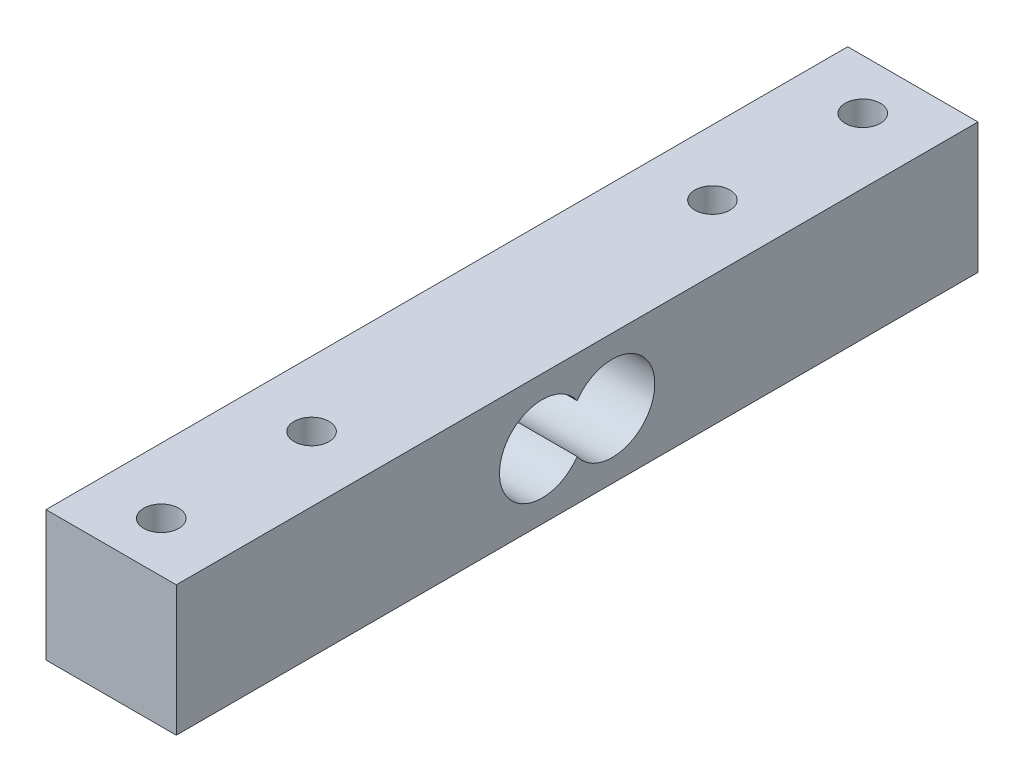
ISO-10303-21;
HEADER;
FILE_DESCRIPTION(('STEP AP214'),'2;1');
FILE_NAME('part.step','',(''),(''),'','','');
FILE_SCHEMA(('AUTOMOTIVE_DESIGN { 1 0 10303 214 1 1 1 1 }'));
ENDSEC;
DATA;
#1=APPLICATION_CONTEXT('core data for automotive mechanical design processes');
#2=APPLICATION_PROTOCOL_DEFINITION('international standard','automotive_design',2000,#1);
#3=PRODUCT_CONTEXT('',#1,'mechanical');
#4=PRODUCT('Part','Part','',(#3));
#5=PRODUCT_RELATED_PRODUCT_CATEGORY('part','',(#4));
#6=PRODUCT_DEFINITION_FORMATION('','',#4);
#7=PRODUCT_DEFINITION_CONTEXT('part definition',#1,'design');
#8=PRODUCT_DEFINITION('design','',#6,#7);
#9=PRODUCT_DEFINITION_SHAPE('','',#8);
#10=(LENGTH_UNIT() NAMED_UNIT(*) SI_UNIT(.MILLI.,.METRE.));
#11=(NAMED_UNIT(*) PLANE_ANGLE_UNIT() SI_UNIT($,.RADIAN.));
#12=(NAMED_UNIT(*) SI_UNIT($,.STERADIAN.) SOLID_ANGLE_UNIT());
#13=UNCERTAINTY_MEASURE_WITH_UNIT(LENGTH_MEASURE(1.E-05),#10,'distance_accuracy_value','');
#14=(GEOMETRIC_REPRESENTATION_CONTEXT(3) GLOBAL_UNCERTAINTY_ASSIGNED_CONTEXT((#13)) GLOBAL_UNIT_ASSIGNED_CONTEXT((#10,
#11,#12)) REPRESENTATION_CONTEXT('',''));
#15=CARTESIAN_POINT('',(0.,0.,0.));
#16=DIRECTION('',(0.,0.,1.));
#17=DIRECTION('',(1.,0.,0.));
#18=AXIS2_PLACEMENT_3D('',#15,#16,#17);
#19=CARTESIAN_POINT('',(6.5,6.5,40.));
#20=DIRECTION('',(-1.,0.,0.));
#21=DIRECTION('',(0.,0.,1.));
#22=AXIS2_PLACEMENT_3D('',#19,#20,#21);
#23=PLANE('',#22);
#24=CARTESIAN_POINT('',(6.5,0.,3.5));
#25=DIRECTION('',(1.,0.,0.));
#26=DIRECTION('',(0.,0.,-1.));
#27=AXIS2_PLACEMENT_3D('',#24,#25,#26);
#28=CIRCLE('',#27,4.25);
#29=CARTESIAN_POINT('',(6.5,2.41091269024824,0.));
#30=VERTEX_POINT('',#29);
#31=CARTESIAN_POINT('',(6.5,-2.41091269024824,0.));
#32=VERTEX_POINT('',#31);
#33=EDGE_CURVE('E99',#30,#32,#28,.T.);
#34=ORIENTED_EDGE('',*,*,#33,.F.);
#35=CARTESIAN_POINT('',(6.5,0.,-3.5));
#36=DIRECTION('',(1.,0.,0.));
#37=DIRECTION('',(0.,0.,-1.));
#38=AXIS2_PLACEMENT_3D('',#35,#36,#37);
#39=CIRCLE('',#38,4.25);
#40=EDGE_CURVE('E54',#32,#30,#39,.T.);
#41=ORIENTED_EDGE('',*,*,#40,.F.);
#42=EDGE_LOOP('',(#34,#41));
#43=FACE_BOUND('',#42,.T.);
#44=DIRECTION('',(0.,0.,-1.));
#45=VECTOR('',#44,1.);
#46=CARTESIAN_POINT('',(6.5,-6.5,40.));
#47=LINE('',#46,#45);
#48=CARTESIAN_POINT('',(6.5,-6.5,40.));
#49=VERTEX_POINT('',#48);
#50=CARTESIAN_POINT('',(6.5,-6.5,-40.));
#51=VERTEX_POINT('',#50);
#52=EDGE_CURVE('E95',#49,#51,#47,.T.);
#53=ORIENTED_EDGE('',*,*,#52,.T.);
#54=DIRECTION('',(0.,-1.,0.));
#55=VECTOR('',#54,1.);
#56=CARTESIAN_POINT('',(6.5,6.5,-40.));
#57=LINE('',#56,#55);
#58=CARTESIAN_POINT('',(6.5,6.5,-40.));
#59=VERTEX_POINT('',#58);
#60=EDGE_CURVE('E11',#59,#51,#57,.T.);
#61=ORIENTED_EDGE('',*,*,#60,.F.);
#62=DIRECTION('',(0.,0.,-1.));
#63=VECTOR('',#62,1.);
#64=CARTESIAN_POINT('',(6.5,6.5,40.));
#65=LINE('',#64,#63);
#66=CARTESIAN_POINT('',(6.5,6.5,40.));
#67=VERTEX_POINT('',#66);
#68=EDGE_CURVE('E123',#67,#59,#65,.T.);
#69=ORIENTED_EDGE('',*,*,#68,.F.);
#70=DIRECTION('',(0.,-1.,0.));
#71=VECTOR('',#70,1.);
#72=CARTESIAN_POINT('',(6.5,6.5,40.));
#73=LINE('',#72,#71);
#74=EDGE_CURVE('E137',#67,#49,#73,.T.);
#75=ORIENTED_EDGE('',*,*,#74,.T.);
#76=EDGE_LOOP('',(#53,#61,#69,#75));
#77=FACE_BOUND('',#76,.T.);
#78=ADVANCED_FACE('F39',(#43,#77),#23,.F.);
#79=CARTESIAN_POINT('',(-6.5,6.5,-40.));
#80=DIRECTION('',(0.,0.,1.));
#81=DIRECTION('',(1.,0.,0.));
#82=AXIS2_PLACEMENT_3D('',#79,#80,#81);
#83=PLANE('',#82);
#84=DIRECTION('',(-1.,0.,0.));
#85=VECTOR('',#84,1.);
#86=CARTESIAN_POINT('',(-6.5,-6.5,-40.));
#87=LINE('',#86,#85);
#88=CARTESIAN_POINT('',(-6.5,-6.5,-40.));
#89=VERTEX_POINT('',#88);
#90=EDGE_CURVE('E141',#51,#89,#87,.T.);
#91=ORIENTED_EDGE('',*,*,#90,.T.);
#92=DIRECTION('',(0.,-1.,0.));
#93=VECTOR('',#92,1.);
#94=CARTESIAN_POINT('',(-6.5,6.5,-40.));
#95=LINE('',#94,#93);
#96=CARTESIAN_POINT('',(-6.5,6.5,-40.));
#97=VERTEX_POINT('',#96);
#98=EDGE_CURVE('E47',#97,#89,#95,.T.);
#99=ORIENTED_EDGE('',*,*,#98,.F.);
#100=DIRECTION('',(-1.,0.,0.));
#101=VECTOR('',#100,1.);
#102=CARTESIAN_POINT('',(-6.5,6.5,-40.));
#103=LINE('',#102,#101);
#104=EDGE_CURVE('E127',#59,#97,#103,.T.);
#105=ORIENTED_EDGE('',*,*,#104,.F.);
#106=ORIENTED_EDGE('',*,*,#60,.T.);
#107=EDGE_LOOP('',(#91,#99,#105,#106));
#108=FACE_BOUND('',#107,.T.);
#109=ADVANCED_FACE('F176',(#108),#83,.F.);
#110=CARTESIAN_POINT('',(-6.5,6.5,40.));
#111=DIRECTION('',(1.,0.,0.));
#112=DIRECTION('',(0.,0.,-1.));
#113=AXIS2_PLACEMENT_3D('',#110,#111,#112);
#114=PLANE('',#113);
#115=CARTESIAN_POINT('',(-6.5,0.,3.5));
#116=DIRECTION('',(1.,0.,0.));
#117=DIRECTION('',(0.,0.,-1.));
#118=AXIS2_PLACEMENT_3D('',#115,#116,#117);
#119=CIRCLE('',#118,4.25);
#120=CARTESIAN_POINT('',(-6.5,2.41091269024824,0.));
#121=VERTEX_POINT('',#120);
#122=CARTESIAN_POINT('',(-6.5,-2.41091269024824,0.));
#123=VERTEX_POINT('',#122);
#124=EDGE_CURVE('E118',#121,#123,#119,.T.);
#125=ORIENTED_EDGE('',*,*,#124,.T.);
#126=CARTESIAN_POINT('',(-6.5,0.,-3.5));
#127=DIRECTION('',(1.,0.,0.));
#128=DIRECTION('',(0.,0.,-1.));
#129=AXIS2_PLACEMENT_3D('',#126,#127,#128);
#130=CIRCLE('',#129,4.25);
#131=EDGE_CURVE('E59',#123,#121,#130,.T.);
#132=ORIENTED_EDGE('',*,*,#131,.T.);
#133=EDGE_LOOP('',(#125,#132));
#134=FACE_BOUND('',#133,.T.);
#135=DIRECTION('',(0.,0.,1.));
#136=VECTOR('',#135,1.);
#137=CARTESIAN_POINT('',(-6.5,-6.5,40.));
#138=LINE('',#137,#136);
#139=CARTESIAN_POINT('',(-6.5,-6.5,40.));
#140=VERTEX_POINT('',#139);
#141=EDGE_CURVE('E144',#89,#140,#138,.T.);
#142=ORIENTED_EDGE('',*,*,#141,.T.);
#143=DIRECTION('',(0.,-1.,0.));
#144=VECTOR('',#143,1.);
#145=CARTESIAN_POINT('',(-6.5,6.5,40.));
#146=LINE('',#145,#144);
#147=CARTESIAN_POINT('',(-6.5,6.5,40.));
#148=VERTEX_POINT('',#147);
#149=EDGE_CURVE('E152',#148,#140,#146,.T.);
#150=ORIENTED_EDGE('',*,*,#149,.F.);
#151=DIRECTION('',(0.,0.,1.));
#152=VECTOR('',#151,1.);
#153=CARTESIAN_POINT('',(-6.5,6.5,40.));
#154=LINE('',#153,#152);
#155=EDGE_CURVE('E131',#97,#148,#154,.T.);
#156=ORIENTED_EDGE('',*,*,#155,.F.);
#157=ORIENTED_EDGE('',*,*,#98,.T.);
#158=EDGE_LOOP('',(#142,#150,#156,#157));
#159=FACE_BOUND('',#158,.T.);
#160=ADVANCED_FACE('F161',(#134,#159),#114,.F.);
#161=CARTESIAN_POINT('',(-6.5,6.5,40.));
#162=DIRECTION('',(0.,0.,-1.));
#163=DIRECTION('',(-1.,0.,0.));
#164=AXIS2_PLACEMENT_3D('',#161,#162,#163);
#165=PLANE('',#164);
#166=DIRECTION('',(1.,0.,0.));
#167=VECTOR('',#166,1.);
#168=CARTESIAN_POINT('',(-6.5,-6.5,40.));
#169=LINE('',#168,#167);
#170=EDGE_CURVE('E128',#140,#49,#169,.T.);
#171=ORIENTED_EDGE('',*,*,#170,.T.);
#172=ORIENTED_EDGE('',*,*,#74,.F.);
#173=DIRECTION('',(1.,0.,0.));
#174=VECTOR('',#173,1.);
#175=CARTESIAN_POINT('',(-6.5,6.5,40.));
#176=LINE('',#175,#174);
#177=EDGE_CURVE('E134',#148,#67,#176,.T.);
#178=ORIENTED_EDGE('',*,*,#177,.F.);
#179=ORIENTED_EDGE('',*,*,#149,.T.);
#180=EDGE_LOOP('',(#171,#172,#178,#179));
#181=FACE_BOUND('',#180,.T.);
#182=ADVANCED_FACE('F170',(#181),#165,.F.);
#183=CARTESIAN_POINT('',(0.,6.5,0.));
#184=DIRECTION('',(0.,-1.,0.));
#185=DIRECTION('',(0.,0.,-1.));
#186=AXIS2_PLACEMENT_3D('',#183,#184,#185);
#187=PLANE('',#186);
#188=CARTESIAN_POINT('',(0.,6.5,35.));
#189=DIRECTION('',(0.,-1.,0.));
#190=DIRECTION('',(0.,0.,-1.));
#191=AXIS2_PLACEMENT_3D('',#188,#189,#190);
#192=CIRCLE('',#191,1.75);
#193=CARTESIAN_POINT('',(0.,6.5,36.75));
#194=VERTEX_POINT('',#193);
#195=EDGE_CURVE('E220',#194,#194,#192,.T.);
#196=ORIENTED_EDGE('',*,*,#195,.T.);
#197=EDGE_LOOP('',(#196));
#198=FACE_BOUND('',#197,.T.);
#199=CARTESIAN_POINT('',(0.,6.5,20.));
#200=DIRECTION('',(0.,-1.,0.));
#201=DIRECTION('',(0.,0.,-1.));
#202=AXIS2_PLACEMENT_3D('',#199,#200,#201);
#203=CIRCLE('',#202,1.75);
#204=CARTESIAN_POINT('',(0.,6.5,21.75));
#205=VERTEX_POINT('',#204);
#206=EDGE_CURVE('E229',#205,#205,#203,.T.);
#207=ORIENTED_EDGE('',*,*,#206,.T.);
#208=EDGE_LOOP('',(#207));
#209=FACE_BOUND('',#208,.T.);
#210=CARTESIAN_POINT('',(0.,6.5,-35.));
#211=DIRECTION('',(0.,1.,0.));
#212=DIRECTION('',(0.,0.,1.));
#213=AXIS2_PLACEMENT_3D('',#210,#211,#212);
#214=CIRCLE('',#213,1.75);
#215=CARTESIAN_POINT('',(0.,6.5,-33.25));
#216=VERTEX_POINT('',#215);
#217=EDGE_CURVE('E110',#216,#216,#214,.T.);
#218=ORIENTED_EDGE('',*,*,#217,.F.);
#219=EDGE_LOOP('',(#218));
#220=FACE_BOUND('',#219,.T.);
#221=CARTESIAN_POINT('',(0.,6.5,-20.));
#222=DIRECTION('',(0.,1.,0.));
#223=DIRECTION('',(0.,0.,1.));
#224=AXIS2_PLACEMENT_3D('',#221,#222,#223);
#225=CIRCLE('',#224,1.75);
#226=CARTESIAN_POINT('',(0.,6.5,-18.25));
#227=VERTEX_POINT('',#226);
#228=EDGE_CURVE('E226',#227,#227,#225,.T.);
#229=ORIENTED_EDGE('',*,*,#228,.F.);
#230=EDGE_LOOP('',(#229));
#231=FACE_BOUND('',#230,.T.);
#232=ORIENTED_EDGE('',*,*,#68,.T.);
#233=ORIENTED_EDGE('',*,*,#104,.T.);
#234=ORIENTED_EDGE('',*,*,#155,.T.);
#235=ORIENTED_EDGE('',*,*,#177,.T.);
#236=EDGE_LOOP('',(#232,#233,#234,#235));
#237=FACE_BOUND('',#236,.T.);
#238=ADVANCED_FACE('F175',(#198,#209,#220,#231,#237),#187,.F.);
#239=CARTESIAN_POINT('',(0.,-6.5,0.));
#240=DIRECTION('',(0.,-1.,0.));
#241=DIRECTION('',(0.,0.,-1.));
#242=AXIS2_PLACEMENT_3D('',#239,#240,#241);
#243=PLANE('',#242);
#244=CARTESIAN_POINT('',(0.,-6.5,35.));
#245=DIRECTION('',(0.,-1.,0.));
#246=DIRECTION('',(0.,0.,-1.));
#247=AXIS2_PLACEMENT_3D('',#244,#245,#246);
#248=CIRCLE('',#247,1.75);
#249=CARTESIAN_POINT('',(0.,-6.5,36.75));
#250=VERTEX_POINT('',#249);
#251=EDGE_CURVE('E217',#250,#250,#248,.T.);
#252=ORIENTED_EDGE('',*,*,#251,.F.);
#253=EDGE_LOOP('',(#252));
#254=FACE_BOUND('',#253,.T.);
#255=CARTESIAN_POINT('',(0.,-6.5,20.));
#256=DIRECTION('',(0.,-1.,0.));
#257=DIRECTION('',(0.,0.,-1.));
#258=AXIS2_PLACEMENT_3D('',#255,#256,#257);
#259=CIRCLE('',#258,1.75);
#260=CARTESIAN_POINT('',(0.,-6.5,21.75));
#261=VERTEX_POINT('',#260);
#262=EDGE_CURVE('E222',#261,#261,#259,.T.);
#263=ORIENTED_EDGE('',*,*,#262,.F.);
#264=EDGE_LOOP('',(#263));
#265=FACE_BOUND('',#264,.T.);
#266=CARTESIAN_POINT('',(0.,-6.5,-35.));
#267=DIRECTION('',(0.,1.,0.));
#268=DIRECTION('',(0.,0.,1.));
#269=AXIS2_PLACEMENT_3D('',#266,#267,#268);
#270=CIRCLE('',#269,1.75);
#271=CARTESIAN_POINT('',(0.,-6.5,-33.25));
#272=VERTEX_POINT('',#271);
#273=EDGE_CURVE('E106',#272,#272,#270,.T.);
#274=ORIENTED_EDGE('',*,*,#273,.T.);
#275=EDGE_LOOP('',(#274));
#276=FACE_BOUND('',#275,.T.);
#277=CARTESIAN_POINT('',(0.,-6.5,-20.));
#278=DIRECTION('',(0.,1.,0.));
#279=DIRECTION('',(0.,0.,1.));
#280=AXIS2_PLACEMENT_3D('',#277,#278,#279);
#281=CIRCLE('',#280,1.75);
#282=CARTESIAN_POINT('',(0.,-6.5,-18.25));
#283=VERTEX_POINT('',#282);
#284=EDGE_CURVE('E113',#283,#283,#281,.T.);
#285=ORIENTED_EDGE('',*,*,#284,.T.);
#286=EDGE_LOOP('',(#285));
#287=FACE_BOUND('',#286,.T.);
#288=ORIENTED_EDGE('',*,*,#52,.F.);
#289=ORIENTED_EDGE('',*,*,#170,.F.);
#290=ORIENTED_EDGE('',*,*,#141,.F.);
#291=ORIENTED_EDGE('',*,*,#90,.F.);
#292=EDGE_LOOP('',(#288,#289,#290,#291));
#293=FACE_BOUND('',#292,.T.);
#294=ADVANCED_FACE('F167',(#254,#265,#276,#287,#293),#243,.T.);
#295=CARTESIAN_POINT('',(-6.5,0.,-3.5));
#296=DIRECTION('',(1.,0.,0.));
#297=DIRECTION('',(0.,0.,-1.));
#298=AXIS2_PLACEMENT_3D('',#295,#296,#297);
#299=CYLINDRICAL_SURFACE('',#298,4.25);
#300=DIRECTION('',(1.,0.,0.));
#301=VECTOR('',#300,1.);
#302=CARTESIAN_POINT('',(-6.5,2.41091269024824,0.));
#303=LINE('',#302,#301);
#304=EDGE_CURVE('E96',#121,#30,#303,.T.);
#305=ORIENTED_EDGE('',*,*,#304,.F.);
#306=ORIENTED_EDGE('',*,*,#131,.F.);
#307=DIRECTION('',(1.,0.,0.));
#308=VECTOR('',#307,1.);
#309=CARTESIAN_POINT('',(-6.5,-2.41091269024824,0.));
#310=LINE('',#309,#308);
#311=EDGE_CURVE('E88',#123,#32,#310,.T.);
#312=ORIENTED_EDGE('',*,*,#311,.T.);
#313=ORIENTED_EDGE('',*,*,#40,.T.);
#314=EDGE_LOOP('',(#305,#306,#312,#313));
#315=FACE_BOUND('',#314,.T.);
#316=ADVANCED_FACE('F90',(#315),#299,.F.);
#317=CARTESIAN_POINT('',(-6.5,0.,3.5));
#318=DIRECTION('',(1.,0.,0.));
#319=DIRECTION('',(0.,0.,-1.));
#320=AXIS2_PLACEMENT_3D('',#317,#318,#319);
#321=CYLINDRICAL_SURFACE('',#320,4.25);
#322=ORIENTED_EDGE('',*,*,#311,.F.);
#323=ORIENTED_EDGE('',*,*,#124,.F.);
#324=ORIENTED_EDGE('',*,*,#304,.T.);
#325=ORIENTED_EDGE('',*,*,#33,.T.);
#326=EDGE_LOOP('',(#322,#323,#324,#325));
#327=FACE_BOUND('',#326,.T.);
#328=ADVANCED_FACE('F100',(#327),#321,.F.);
#329=CARTESIAN_POINT('',(0.,-6.5,-20.));
#330=DIRECTION('',(0.,1.,0.));
#331=DIRECTION('',(0.,0.,1.));
#332=AXIS2_PLACEMENT_3D('',#329,#330,#331);
#333=CYLINDRICAL_SURFACE('',#332,1.75);
#334=CARTESIAN_POINT('',(0.,-6.5,-18.25));
#335=CARTESIAN_POINT('',(0.,-6.36458333333333,-18.25));
#336=CARTESIAN_POINT('',(0.,-6.22916666666667,-18.25));
#337=CARTESIAN_POINT('',(0.,-5.95833333333333,-18.25));
#338=CARTESIAN_POINT('',(0.,-5.82291666666667,-18.25));
#339=CARTESIAN_POINT('',(0.,-5.55208333333333,-18.25));
#340=CARTESIAN_POINT('',(0.,-5.41666666666667,-18.25));
#341=CARTESIAN_POINT('',(0.,-5.14583333333333,-18.25));
#342=CARTESIAN_POINT('',(0.,-5.01041666666667,-18.25));
#343=CARTESIAN_POINT('',(0.,-4.73958333333333,-18.25));
#344=CARTESIAN_POINT('',(0.,-4.60416666666667,-18.25));
#345=CARTESIAN_POINT('',(0.,-4.33333333333333,-18.25));
#346=CARTESIAN_POINT('',(0.,-4.19791666666667,-18.25));
#347=CARTESIAN_POINT('',(0.,-3.92708333333333,-18.25));
#348=CARTESIAN_POINT('',(0.,-3.79166666666667,-18.25));
#349=CARTESIAN_POINT('',(0.,-3.52083333333333,-18.25));
#350=CARTESIAN_POINT('',(0.,-3.38541666666667,-18.25));
#351=CARTESIAN_POINT('',(0.,-3.11458333333333,-18.25));
#352=CARTESIAN_POINT('',(0.,-2.97916666666667,-18.25));
#353=CARTESIAN_POINT('',(0.,-2.70833333333333,-18.25));
#354=CARTESIAN_POINT('',(0.,-2.57291666666667,-18.25));
#355=CARTESIAN_POINT('',(0.,-2.30208333333333,-18.25));
#356=CARTESIAN_POINT('',(0.,-2.16666666666667,-18.25));
#357=CARTESIAN_POINT('',(0.,-1.89583333333333,-18.25));
#358=CARTESIAN_POINT('',(0.,-1.76041666666667,-18.25));
#359=CARTESIAN_POINT('',(0.,-1.48958333333333,-18.25));
#360=CARTESIAN_POINT('',(0.,-1.35416666666667,-18.25));
#361=CARTESIAN_POINT('',(0.,-1.08333333333333,-18.25));
#362=CARTESIAN_POINT('',(0.,-0.947916666666668,-18.25));
#363=CARTESIAN_POINT('',(0.,-0.677083333333334,-18.25));
#364=CARTESIAN_POINT('',(0.,-0.541666666666668,-18.25));
#365=CARTESIAN_POINT('',(0.,-0.270833333333334,-18.25));
#366=CARTESIAN_POINT('',(0.,-0.135416666666668,-18.25));
#367=CARTESIAN_POINT('',(0.,0.135416666666666,-18.25));
#368=CARTESIAN_POINT('',(0.,0.270833333333333,-18.25));
#369=CARTESIAN_POINT('',(0.,0.541666666666666,-18.25));
#370=CARTESIAN_POINT('',(0.,0.677083333333332,-18.25));
#371=CARTESIAN_POINT('',(0.,0.947916666666666,-18.25));
#372=CARTESIAN_POINT('',(0.,1.08333333333333,-18.25));
#373=CARTESIAN_POINT('',(0.,1.35416666666667,-18.25));
#374=CARTESIAN_POINT('',(0.,1.48958333333333,-18.25));
#375=CARTESIAN_POINT('',(0.,1.76041666666667,-18.25));
#376=CARTESIAN_POINT('',(0.,1.89583333333333,-18.25));
#377=CARTESIAN_POINT('',(0.,2.16666666666667,-18.25));
#378=CARTESIAN_POINT('',(0.,2.30208333333333,-18.25));
#379=CARTESIAN_POINT('',(0.,2.57291666666667,-18.25));
#380=CARTESIAN_POINT('',(0.,2.70833333333333,-18.25));
#381=CARTESIAN_POINT('',(0.,2.97916666666667,-18.25));
#382=CARTESIAN_POINT('',(0.,3.11458333333333,-18.25));
#383=CARTESIAN_POINT('',(0.,3.38541666666667,-18.25));
#384=CARTESIAN_POINT('',(0.,3.52083333333333,-18.25));
#385=CARTESIAN_POINT('',(0.,3.79166666666667,-18.25));
#386=CARTESIAN_POINT('',(0.,3.92708333333333,-18.25));
#387=CARTESIAN_POINT('',(0.,4.19791666666667,-18.25));
#388=CARTESIAN_POINT('',(0.,4.33333333333333,-18.25));
#389=CARTESIAN_POINT('',(0.,4.60416666666667,-18.25));
#390=CARTESIAN_POINT('',(0.,4.73958333333333,-18.25));
#391=CARTESIAN_POINT('',(0.,5.01041666666667,-18.25));
#392=CARTESIAN_POINT('',(0.,5.14583333333333,-18.25));
#393=CARTESIAN_POINT('',(0.,5.41666666666667,-18.25));
#394=CARTESIAN_POINT('',(0.,5.55208333333333,-18.25));
#395=CARTESIAN_POINT('',(0.,5.82291666666667,-18.25));
#396=CARTESIAN_POINT('',(0.,5.95833333333333,-18.25));
#397=CARTESIAN_POINT('',(0.,6.22916666666667,-18.25));
#398=CARTESIAN_POINT('',(0.,6.36458333333333,-18.25));
#399=CARTESIAN_POINT('',(0.,6.5,-18.25));
#400=B_SPLINE_CURVE_WITH_KNOTS('',3,(#334,#335,#336,#337,#338,#339,#340,#341,#342,#343,#344,
#345,#346,#347,#348,#349,#350,#351,#352,#353,#354,#355,#356,#357,#358,#359,#360,#361,#362,#363,
#364,#365,#366,#367,#368,#369,#370,#371,#372,#373,#374,#375,#376,#377,#378,#379,#380,#381,#382,
#383,#384,#385,#386,#387,#388,#389,#390,#391,#392,#393,#394,#395,#396,#397,#398,#399),
.UNSPECIFIED.,.F.,.F.,(4,2,2,2,2,2,2,2,2,2,2,2,2,2,2,2,2,2,2,2,2,2,2,2,2,2,2,2,2,2,2,2,4),(0.,
0.40625,0.812500000000001,1.21875,1.625,2.03125,2.4375,2.84375,3.25,3.65625,4.0625,4.46875,
4.875,5.28125,5.6875,6.09375,6.5,6.90625,7.3125,7.71875,8.125,8.53125,8.9375,9.34375,9.75,
10.15625,10.5625,10.96875,11.375,11.78125,12.1875,12.59375,13.),.UNSPECIFIED.);
#401=EDGE_CURVE('BSEAM197',#283,#227,#400,.T.);
#402=ORIENTED_EDGE('',*,*,#284,.F.);
#403=ORIENTED_EDGE('',*,*,#228,.T.);
#404=ORIENTED_EDGE('',*,*,#401,.T.);
#405=ORIENTED_EDGE('',*,*,#401,.F.);
#406=EDGE_LOOP('',(#402,#404,#403,#405));
#407=FACE_BOUND('',#406,.T.);
#408=ADVANCED_FACE('F197',(#407),#333,.F.);
#409=CARTESIAN_POINT('',(0.,-6.5,-35.));
#410=DIRECTION('',(0.,1.,0.));
#411=DIRECTION('',(0.,0.,1.));
#412=AXIS2_PLACEMENT_3D('',#409,#410,#411);
#413=CYLINDRICAL_SURFACE('',#412,1.75);
#414=CARTESIAN_POINT('',(0.,-6.5,-33.25));
#415=CARTESIAN_POINT('',(0.,-6.36458333333333,-33.25));
#416=CARTESIAN_POINT('',(0.,-6.22916666666667,-33.25));
#417=CARTESIAN_POINT('',(0.,-5.95833333333333,-33.25));
#418=CARTESIAN_POINT('',(0.,-5.82291666666667,-33.25));
#419=CARTESIAN_POINT('',(0.,-5.55208333333333,-33.25));
#420=CARTESIAN_POINT('',(0.,-5.41666666666667,-33.25));
#421=CARTESIAN_POINT('',(0.,-5.14583333333333,-33.25));
#422=CARTESIAN_POINT('',(0.,-5.01041666666667,-33.25));
#423=CARTESIAN_POINT('',(0.,-4.73958333333333,-33.25));
#424=CARTESIAN_POINT('',(0.,-4.60416666666667,-33.25));
#425=CARTESIAN_POINT('',(0.,-4.33333333333333,-33.25));
#426=CARTESIAN_POINT('',(0.,-4.19791666666667,-33.25));
#427=CARTESIAN_POINT('',(0.,-3.92708333333333,-33.25));
#428=CARTESIAN_POINT('',(0.,-3.79166666666667,-33.25));
#429=CARTESIAN_POINT('',(0.,-3.52083333333333,-33.25));
#430=CARTESIAN_POINT('',(0.,-3.38541666666667,-33.25));
#431=CARTESIAN_POINT('',(0.,-3.11458333333333,-33.25));
#432=CARTESIAN_POINT('',(0.,-2.97916666666667,-33.25));
#433=CARTESIAN_POINT('',(0.,-2.70833333333333,-33.25));
#434=CARTESIAN_POINT('',(0.,-2.57291666666667,-33.25));
#435=CARTESIAN_POINT('',(0.,-2.30208333333333,-33.25));
#436=CARTESIAN_POINT('',(0.,-2.16666666666667,-33.25));
#437=CARTESIAN_POINT('',(0.,-1.89583333333333,-33.25));
#438=CARTESIAN_POINT('',(0.,-1.76041666666667,-33.25));
#439=CARTESIAN_POINT('',(0.,-1.48958333333333,-33.25));
#440=CARTESIAN_POINT('',(0.,-1.35416666666667,-33.25));
#441=CARTESIAN_POINT('',(0.,-1.08333333333333,-33.25));
#442=CARTESIAN_POINT('',(0.,-0.947916666666668,-33.25));
#443=CARTESIAN_POINT('',(0.,-0.677083333333334,-33.25));
#444=CARTESIAN_POINT('',(0.,-0.541666666666668,-33.25));
#445=CARTESIAN_POINT('',(0.,-0.270833333333334,-33.25));
#446=CARTESIAN_POINT('',(0.,-0.135416666666668,-33.25));
#447=CARTESIAN_POINT('',(0.,0.135416666666666,-33.25));
#448=CARTESIAN_POINT('',(0.,0.270833333333333,-33.25));
#449=CARTESIAN_POINT('',(0.,0.541666666666666,-33.25));
#450=CARTESIAN_POINT('',(0.,0.677083333333332,-33.25));
#451=CARTESIAN_POINT('',(0.,0.947916666666666,-33.25));
#452=CARTESIAN_POINT('',(0.,1.08333333333333,-33.25));
#453=CARTESIAN_POINT('',(0.,1.35416666666667,-33.25));
#454=CARTESIAN_POINT('',(0.,1.48958333333333,-33.25));
#455=CARTESIAN_POINT('',(0.,1.76041666666667,-33.25));
#456=CARTESIAN_POINT('',(0.,1.89583333333333,-33.25));
#457=CARTESIAN_POINT('',(0.,2.16666666666667,-33.25));
#458=CARTESIAN_POINT('',(0.,2.30208333333333,-33.25));
#459=CARTESIAN_POINT('',(0.,2.57291666666667,-33.25));
#460=CARTESIAN_POINT('',(0.,2.70833333333333,-33.25));
#461=CARTESIAN_POINT('',(0.,2.97916666666667,-33.25));
#462=CARTESIAN_POINT('',(0.,3.11458333333333,-33.25));
#463=CARTESIAN_POINT('',(0.,3.38541666666667,-33.25));
#464=CARTESIAN_POINT('',(0.,3.52083333333333,-33.25));
#465=CARTESIAN_POINT('',(0.,3.79166666666667,-33.25));
#466=CARTESIAN_POINT('',(0.,3.92708333333333,-33.25));
#467=CARTESIAN_POINT('',(0.,4.19791666666667,-33.25));
#468=CARTESIAN_POINT('',(0.,4.33333333333333,-33.25));
#469=CARTESIAN_POINT('',(0.,4.60416666666667,-33.25));
#470=CARTESIAN_POINT('',(0.,4.73958333333333,-33.25));
#471=CARTESIAN_POINT('',(0.,5.01041666666667,-33.25));
#472=CARTESIAN_POINT('',(0.,5.14583333333333,-33.25));
#473=CARTESIAN_POINT('',(0.,5.41666666666667,-33.25));
#474=CARTESIAN_POINT('',(0.,5.55208333333333,-33.25));
#475=CARTESIAN_POINT('',(0.,5.82291666666667,-33.25));
#476=CARTESIAN_POINT('',(0.,5.95833333333333,-33.25));
#477=CARTESIAN_POINT('',(0.,6.22916666666667,-33.25));
#478=CARTESIAN_POINT('',(0.,6.36458333333333,-33.25));
#479=CARTESIAN_POINT('',(0.,6.5,-33.25));
#480=B_SPLINE_CURVE_WITH_KNOTS('',3,(#414,#415,#416,#417,#418,#419,#420,#421,#422,#423,#424,
#425,#426,#427,#428,#429,#430,#431,#432,#433,#434,#435,#436,#437,#438,#439,#440,#441,#442,#443,
#444,#445,#446,#447,#448,#449,#450,#451,#452,#453,#454,#455,#456,#457,#458,#459,#460,#461,#462,
#463,#464,#465,#466,#467,#468,#469,#470,#471,#472,#473,#474,#475,#476,#477,#478,#479),
.UNSPECIFIED.,.F.,.F.,(4,2,2,2,2,2,2,2,2,2,2,2,2,2,2,2,2,2,2,2,2,2,2,2,2,2,2,2,2,2,2,2,4),(0.,
0.40625,0.812500000000001,1.21875,1.625,2.03125,2.4375,2.84375,3.25,3.65625,4.0625,4.46875,
4.875,5.28125,5.6875,6.09375,6.5,6.90625,7.3125,7.71875,8.125,8.53125,8.9375,9.34375,9.75,
10.15625,10.5625,10.96875,11.375,11.78125,12.1875,12.59375,13.),.UNSPECIFIED.);
#481=EDGE_CURVE('BSEAM200',#272,#216,#480,.T.);
#482=ORIENTED_EDGE('',*,*,#273,.F.);
#483=ORIENTED_EDGE('',*,*,#217,.T.);
#484=ORIENTED_EDGE('',*,*,#481,.T.);
#485=ORIENTED_EDGE('',*,*,#481,.F.);
#486=EDGE_LOOP('',(#482,#484,#483,#485));
#487=FACE_BOUND('',#486,.T.);
#488=ADVANCED_FACE('F200',(#487),#413,.F.);
#489=CARTESIAN_POINT('',(0.,-6.5,20.));
#490=DIRECTION('',(0.,1.,0.));
#491=DIRECTION('',(0.,0.,1.));
#492=AXIS2_PLACEMENT_3D('',#489,#490,#491);
#493=CYLINDRICAL_SURFACE('',#492,1.75);
#494=CARTESIAN_POINT('',(0.,-6.5,21.75));
#495=CARTESIAN_POINT('',(0.,-6.36458333333333,21.75));
#496=CARTESIAN_POINT('',(0.,-6.22916666666667,21.75));
#497=CARTESIAN_POINT('',(0.,-5.95833333333333,21.75));
#498=CARTESIAN_POINT('',(0.,-5.82291666666667,21.75));
#499=CARTESIAN_POINT('',(0.,-5.55208333333333,21.75));
#500=CARTESIAN_POINT('',(0.,-5.41666666666667,21.75));
#501=CARTESIAN_POINT('',(0.,-5.14583333333333,21.75));
#502=CARTESIAN_POINT('',(0.,-5.01041666666667,21.75));
#503=CARTESIAN_POINT('',(0.,-4.73958333333333,21.75));
#504=CARTESIAN_POINT('',(0.,-4.60416666666667,21.75));
#505=CARTESIAN_POINT('',(0.,-4.33333333333333,21.75));
#506=CARTESIAN_POINT('',(0.,-4.19791666666667,21.75));
#507=CARTESIAN_POINT('',(0.,-3.92708333333333,21.75));
#508=CARTESIAN_POINT('',(0.,-3.79166666666667,21.75));
#509=CARTESIAN_POINT('',(0.,-3.52083333333333,21.75));
#510=CARTESIAN_POINT('',(0.,-3.38541666666667,21.75));
#511=CARTESIAN_POINT('',(0.,-3.11458333333333,21.75));
#512=CARTESIAN_POINT('',(0.,-2.97916666666667,21.75));
#513=CARTESIAN_POINT('',(0.,-2.70833333333333,21.75));
#514=CARTESIAN_POINT('',(0.,-2.57291666666667,21.75));
#515=CARTESIAN_POINT('',(0.,-2.30208333333333,21.75));
#516=CARTESIAN_POINT('',(0.,-2.16666666666667,21.75));
#517=CARTESIAN_POINT('',(0.,-1.89583333333333,21.75));
#518=CARTESIAN_POINT('',(0.,-1.76041666666667,21.75));
#519=CARTESIAN_POINT('',(0.,-1.48958333333333,21.75));
#520=CARTESIAN_POINT('',(0.,-1.35416666666667,21.75));
#521=CARTESIAN_POINT('',(0.,-1.08333333333333,21.75));
#522=CARTESIAN_POINT('',(0.,-0.947916666666666,21.75));
#523=CARTESIAN_POINT('',(0.,-0.677083333333332,21.75));
#524=CARTESIAN_POINT('',(0.,-0.541666666666666,21.75));
#525=CARTESIAN_POINT('',(0.,-0.270833333333333,21.75));
#526=CARTESIAN_POINT('',(0.,-0.135416666666666,21.75));
#527=CARTESIAN_POINT('',(0.,0.135416666666668,21.75));
#528=CARTESIAN_POINT('',(0.,0.270833333333334,21.75));
#529=CARTESIAN_POINT('',(0.,0.541666666666668,21.75));
#530=CARTESIAN_POINT('',(0.,0.677083333333334,21.75));
#531=CARTESIAN_POINT('',(0.,0.947916666666667,21.75));
#532=CARTESIAN_POINT('',(0.,1.08333333333333,21.75));
#533=CARTESIAN_POINT('',(0.,1.35416666666667,21.75));
#534=CARTESIAN_POINT('',(0.,1.48958333333333,21.75));
#535=CARTESIAN_POINT('',(0.,1.76041666666667,21.75));
#536=CARTESIAN_POINT('',(0.,1.89583333333333,21.75));
#537=CARTESIAN_POINT('',(0.,2.16666666666667,21.75));
#538=CARTESIAN_POINT('',(0.,2.30208333333333,21.75));
#539=CARTESIAN_POINT('',(0.,2.57291666666667,21.75));
#540=CARTESIAN_POINT('',(0.,2.70833333333333,21.75));
#541=CARTESIAN_POINT('',(0.,2.97916666666667,21.75));
#542=CARTESIAN_POINT('',(0.,3.11458333333333,21.75));
#543=CARTESIAN_POINT('',(0.,3.38541666666667,21.75));
#544=CARTESIAN_POINT('',(0.,3.52083333333333,21.75));
#545=CARTESIAN_POINT('',(0.,3.79166666666667,21.75));
#546=CARTESIAN_POINT('',(0.,3.92708333333333,21.75));
#547=CARTESIAN_POINT('',(0.,4.19791666666667,21.75));
#548=CARTESIAN_POINT('',(0.,4.33333333333333,21.75));
#549=CARTESIAN_POINT('',(0.,4.60416666666667,21.75));
#550=CARTESIAN_POINT('',(0.,4.73958333333333,21.75));
#551=CARTESIAN_POINT('',(0.,5.01041666666667,21.75));
#552=CARTESIAN_POINT('',(0.,5.14583333333333,21.75));
#553=CARTESIAN_POINT('',(0.,5.41666666666667,21.75));
#554=CARTESIAN_POINT('',(0.,5.55208333333333,21.75));
#555=CARTESIAN_POINT('',(0.,5.82291666666667,21.75));
#556=CARTESIAN_POINT('',(0.,5.95833333333333,21.75));
#557=CARTESIAN_POINT('',(0.,6.22916666666667,21.75));
#558=CARTESIAN_POINT('',(0.,6.36458333333333,21.75));
#559=CARTESIAN_POINT('',(0.,6.5,21.75));
#560=B_SPLINE_CURVE_WITH_KNOTS('',3,(#494,#495,#496,#497,#498,#499,#500,#501,#502,#503,#504,
#505,#506,#507,#508,#509,#510,#511,#512,#513,#514,#515,#516,#517,#518,#519,#520,#521,#522,#523,
#524,#525,#526,#527,#528,#529,#530,#531,#532,#533,#534,#535,#536,#537,#538,#539,#540,#541,#542,
#543,#544,#545,#546,#547,#548,#549,#550,#551,#552,#553,#554,#555,#556,#557,#558,#559),
.UNSPECIFIED.,.F.,.F.,(4,2,2,2,2,2,2,2,2,2,2,2,2,2,2,2,2,2,2,2,2,2,2,2,2,2,2,2,2,2,2,2,4),(0.,
0.40625,0.8125,1.21875,1.625,2.03125,2.4375,2.84375,3.25,3.65625,4.0625,4.46875,4.875,5.28125,
5.6875,6.09375,6.5,6.90625,7.3125,7.71875,8.125,8.53125,8.9375,9.34375,9.75,10.15625,10.5625,
10.96875,11.375,11.78125,12.1875,12.59375,13.),.UNSPECIFIED.);
#561=EDGE_CURVE('BSEAM204',#261,#205,#560,.T.);
#562=ORIENTED_EDGE('',*,*,#262,.T.);
#563=ORIENTED_EDGE('',*,*,#206,.F.);
#564=ORIENTED_EDGE('',*,*,#561,.T.);
#565=ORIENTED_EDGE('',*,*,#561,.F.);
#566=EDGE_LOOP('',(#562,#564,#563,#565));
#567=FACE_BOUND('',#566,.T.);
#568=ADVANCED_FACE('F204',(#567),#493,.F.);
#569=CARTESIAN_POINT('',(0.,-6.5,35.));
#570=DIRECTION('',(0.,1.,0.));
#571=DIRECTION('',(0.,0.,1.));
#572=AXIS2_PLACEMENT_3D('',#569,#570,#571);
#573=CYLINDRICAL_SURFACE('',#572,1.75);
#574=CARTESIAN_POINT('',(0.,-6.5,36.75));
#575=CARTESIAN_POINT('',(0.,-6.36458333333333,36.75));
#576=CARTESIAN_POINT('',(0.,-6.22916666666667,36.75));
#577=CARTESIAN_POINT('',(0.,-5.95833333333333,36.75));
#578=CARTESIAN_POINT('',(0.,-5.82291666666667,36.75));
#579=CARTESIAN_POINT('',(0.,-5.55208333333333,36.75));
#580=CARTESIAN_POINT('',(0.,-5.41666666666667,36.75));
#581=CARTESIAN_POINT('',(0.,-5.14583333333333,36.75));
#582=CARTESIAN_POINT('',(0.,-5.01041666666667,36.75));
#583=CARTESIAN_POINT('',(0.,-4.73958333333333,36.75));
#584=CARTESIAN_POINT('',(0.,-4.60416666666667,36.75));
#585=CARTESIAN_POINT('',(0.,-4.33333333333333,36.75));
#586=CARTESIAN_POINT('',(0.,-4.19791666666667,36.75));
#587=CARTESIAN_POINT('',(0.,-3.92708333333333,36.75));
#588=CARTESIAN_POINT('',(0.,-3.79166666666667,36.75));
#589=CARTESIAN_POINT('',(0.,-3.52083333333333,36.75));
#590=CARTESIAN_POINT('',(0.,-3.38541666666667,36.75));
#591=CARTESIAN_POINT('',(0.,-3.11458333333333,36.75));
#592=CARTESIAN_POINT('',(0.,-2.97916666666667,36.75));
#593=CARTESIAN_POINT('',(0.,-2.70833333333333,36.75));
#594=CARTESIAN_POINT('',(0.,-2.57291666666667,36.75));
#595=CARTESIAN_POINT('',(0.,-2.30208333333333,36.75));
#596=CARTESIAN_POINT('',(0.,-2.16666666666667,36.75));
#597=CARTESIAN_POINT('',(0.,-1.89583333333333,36.75));
#598=CARTESIAN_POINT('',(0.,-1.76041666666667,36.75));
#599=CARTESIAN_POINT('',(0.,-1.48958333333333,36.75));
#600=CARTESIAN_POINT('',(0.,-1.35416666666667,36.75));
#601=CARTESIAN_POINT('',(0.,-1.08333333333333,36.75));
#602=CARTESIAN_POINT('',(0.,-0.947916666666666,36.75));
#603=CARTESIAN_POINT('',(0.,-0.677083333333332,36.75));
#604=CARTESIAN_POINT('',(0.,-0.541666666666666,36.75));
#605=CARTESIAN_POINT('',(0.,-0.270833333333333,36.75));
#606=CARTESIAN_POINT('',(0.,-0.135416666666666,36.75));
#607=CARTESIAN_POINT('',(0.,0.135416666666668,36.75));
#608=CARTESIAN_POINT('',(0.,0.270833333333334,36.75));
#609=CARTESIAN_POINT('',(0.,0.541666666666668,36.75));
#610=CARTESIAN_POINT('',(0.,0.677083333333334,36.75));
#611=CARTESIAN_POINT('',(0.,0.947916666666667,36.75));
#612=CARTESIAN_POINT('',(0.,1.08333333333333,36.75));
#613=CARTESIAN_POINT('',(0.,1.35416666666667,36.75));
#614=CARTESIAN_POINT('',(0.,1.48958333333333,36.75));
#615=CARTESIAN_POINT('',(0.,1.76041666666667,36.75));
#616=CARTESIAN_POINT('',(0.,1.89583333333333,36.75));
#617=CARTESIAN_POINT('',(0.,2.16666666666667,36.75));
#618=CARTESIAN_POINT('',(0.,2.30208333333333,36.75));
#619=CARTESIAN_POINT('',(0.,2.57291666666667,36.75));
#620=CARTESIAN_POINT('',(0.,2.70833333333333,36.75));
#621=CARTESIAN_POINT('',(0.,2.97916666666667,36.75));
#622=CARTESIAN_POINT('',(0.,3.11458333333333,36.75));
#623=CARTESIAN_POINT('',(0.,3.38541666666667,36.75));
#624=CARTESIAN_POINT('',(0.,3.52083333333333,36.75));
#625=CARTESIAN_POINT('',(0.,3.79166666666667,36.75));
#626=CARTESIAN_POINT('',(0.,3.92708333333333,36.75));
#627=CARTESIAN_POINT('',(0.,4.19791666666667,36.75));
#628=CARTESIAN_POINT('',(0.,4.33333333333333,36.75));
#629=CARTESIAN_POINT('',(0.,4.60416666666667,36.75));
#630=CARTESIAN_POINT('',(0.,4.73958333333333,36.75));
#631=CARTESIAN_POINT('',(0.,5.01041666666667,36.75));
#632=CARTESIAN_POINT('',(0.,5.14583333333333,36.75));
#633=CARTESIAN_POINT('',(0.,5.41666666666667,36.75));
#634=CARTESIAN_POINT('',(0.,5.55208333333333,36.75));
#635=CARTESIAN_POINT('',(0.,5.82291666666667,36.75));
#636=CARTESIAN_POINT('',(0.,5.95833333333333,36.75));
#637=CARTESIAN_POINT('',(0.,6.22916666666667,36.75));
#638=CARTESIAN_POINT('',(0.,6.36458333333333,36.75));
#639=CARTESIAN_POINT('',(0.,6.5,36.75));
#640=B_SPLINE_CURVE_WITH_KNOTS('',3,(#574,#575,#576,#577,#578,#579,#580,#581,#582,#583,#584,
#585,#586,#587,#588,#589,#590,#591,#592,#593,#594,#595,#596,#597,#598,#599,#600,#601,#602,#603,
#604,#605,#606,#607,#608,#609,#610,#611,#612,#613,#614,#615,#616,#617,#618,#619,#620,#621,#622,
#623,#624,#625,#626,#627,#628,#629,#630,#631,#632,#633,#634,#635,#636,#637,#638,#639),
.UNSPECIFIED.,.F.,.F.,(4,2,2,2,2,2,2,2,2,2,2,2,2,2,2,2,2,2,2,2,2,2,2,2,2,2,2,2,2,2,2,2,4),(0.,
0.40625,0.8125,1.21875,1.625,2.03125,2.4375,2.84375,3.25,3.65625,4.0625,4.46875,4.875,5.28125,
5.6875,6.09375,6.5,6.90625,7.3125,7.71875,8.125,8.53125,8.9375,9.34375,9.75,10.15625,10.5625,
10.96875,11.375,11.78125,12.1875,12.59375,13.),.UNSPECIFIED.);
#641=EDGE_CURVE('BSEAM208',#250,#194,#640,.T.);
#642=ORIENTED_EDGE('',*,*,#251,.T.);
#643=ORIENTED_EDGE('',*,*,#195,.F.);
#644=ORIENTED_EDGE('',*,*,#641,.T.);
#645=ORIENTED_EDGE('',*,*,#641,.F.);
#646=EDGE_LOOP('',(#642,#644,#643,#645));
#647=FACE_BOUND('',#646,.T.);
#648=ADVANCED_FACE('F208',(#647),#573,.F.);
#649=CLOSED_SHELL('',(#78,#109,#160,#182,#238,#294,#316,#328,#408,#488,#568,#648));
#650=MANIFOLD_SOLID_BREP('B2',#649);
#651=ADVANCED_BREP_SHAPE_REPRESENTATION('',(#18,#650),#14);
#652=SHAPE_DEFINITION_REPRESENTATION(#9,#651);
ENDSEC;
END-ISO-10303-21;
